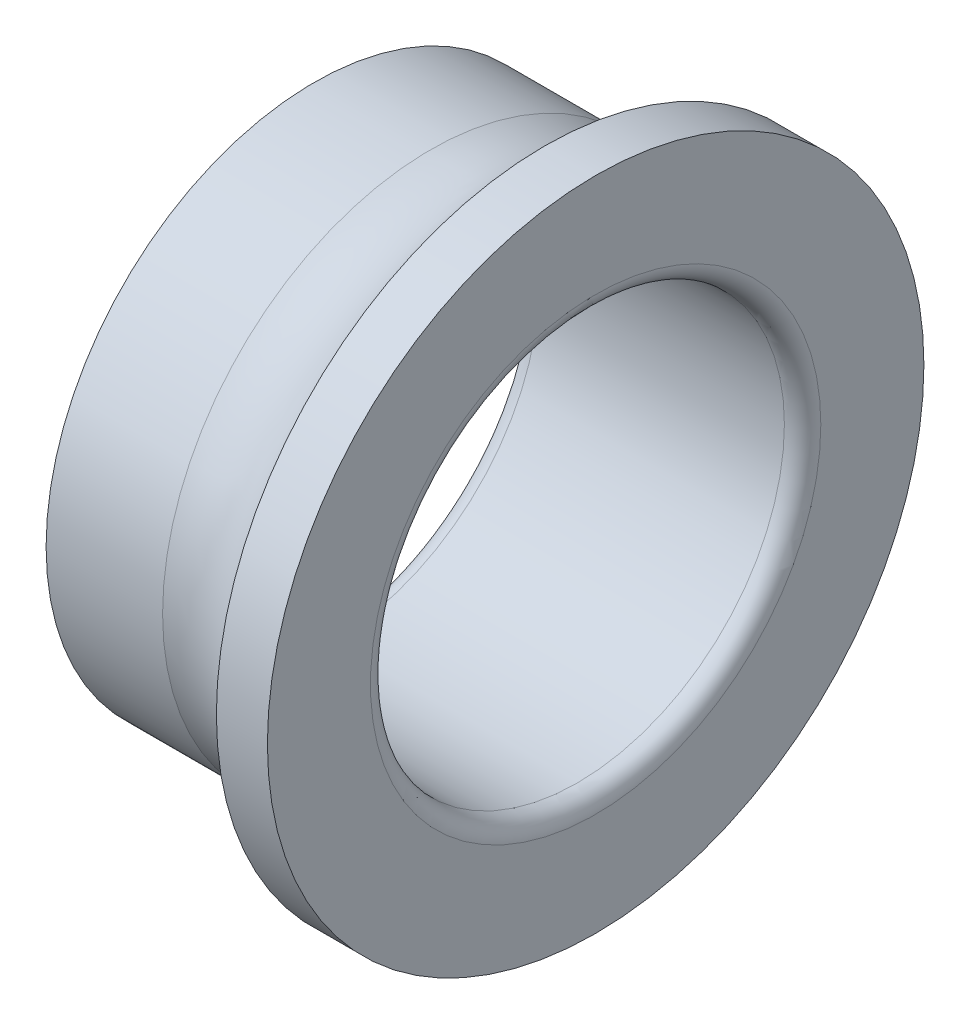
ISO-10303-21;
HEADER;
FILE_DESCRIPTION(('STEP AP214'),'2;1');
FILE_NAME('part.step','',(''),(''),'','','');
FILE_SCHEMA(('AUTOMOTIVE_DESIGN { 1 0 10303 214 1 1 1 1 }'));
ENDSEC;
DATA;
#1=APPLICATION_CONTEXT('core data for automotive mechanical design processes');
#2=APPLICATION_PROTOCOL_DEFINITION('international standard','automotive_design',2000,#1);
#3=PRODUCT_CONTEXT('',#1,'mechanical');
#4=PRODUCT('Part','Part','',(#3));
#5=PRODUCT_RELATED_PRODUCT_CATEGORY('part','',(#4));
#6=PRODUCT_DEFINITION_FORMATION('','',#4);
#7=PRODUCT_DEFINITION_CONTEXT('part definition',#1,'design');
#8=PRODUCT_DEFINITION('design','',#6,#7);
#9=PRODUCT_DEFINITION_SHAPE('','',#8);
#10=(LENGTH_UNIT() NAMED_UNIT(*) SI_UNIT(.MILLI.,.METRE.));
#11=(NAMED_UNIT(*) PLANE_ANGLE_UNIT() SI_UNIT($,.RADIAN.));
#12=(NAMED_UNIT(*) SI_UNIT($,.STERADIAN.) SOLID_ANGLE_UNIT());
#13=UNCERTAINTY_MEASURE_WITH_UNIT(LENGTH_MEASURE(1.E-05),#10,'distance_accuracy_value','');
#14=(GEOMETRIC_REPRESENTATION_CONTEXT(3) GLOBAL_UNCERTAINTY_ASSIGNED_CONTEXT((#13)) GLOBAL_UNIT_ASSIGNED_CONTEXT((#10,
#11,#12)) REPRESENTATION_CONTEXT('',''));
#15=CARTESIAN_POINT('',(0.,0.,0.));
#16=DIRECTION('',(0.,0.,1.));
#17=DIRECTION('',(1.,0.,0.));
#18=AXIS2_PLACEMENT_3D('',#15,#16,#17);
#19=CARTESIAN_POINT('',(8.5,0.,0.));
#20=DIRECTION('',(1.,0.,0.));
#21=DIRECTION('',(0.,0.,-1.));
#22=AXIS2_PLACEMENT_3D('',#19,#20,#21);
#23=TOROIDAL_SURFACE('',#22,21.75,5.75);
#24=CARTESIAN_POINT('',(7.03408731501497,0.,0.));
#25=DIRECTION('',(-1.,0.,0.));
#26=DIRECTION('',(0.,0.,1.));
#27=AXIS2_PLACEMENT_3D('',#24,#25,#26);
#28=CIRCLE('',#27,16.19);
#29=CARTESIAN_POINT('',(7.03408731501497,0.,16.19));
#30=VERTEX_POINT('',#29);
#31=EDGE_CURVE('E115',#30,#30,#28,.T.);
#32=ORIENTED_EDGE('',*,*,#31,.F.);
#33=EDGE_LOOP('',(#32));
#34=FACE_BOUND('',#33,.T.);
#35=CARTESIAN_POINT('',(13.9181985013471,0.,0.));
#36=DIRECTION('',(-1.,0.,0.));
#37=DIRECTION('',(0.,0.,1.));
#38=AXIS2_PLACEMENT_3D('',#35,#36,#37);
#39=CIRCLE('',#38,19.825);
#40=CARTESIAN_POINT('',(13.9181985013471,0.,19.825));
#41=VERTEX_POINT('',#40);
#42=EDGE_CURVE('E120',#41,#41,#39,.F.);
#43=ORIENTED_EDGE('',*,*,#42,.F.);
#44=EDGE_LOOP('',(#43));
#45=FACE_BOUND('',#44,.T.);
#46=ADVANCED_FACE('F20',(#34,#45),#23,.F.);
#47=CARTESIAN_POINT('',(17.,0.,0.));
#48=DIRECTION('',(-1.,0.,0.));
#49=DIRECTION('',(0.,0.,1.));
#50=AXIS2_PLACEMENT_3D('',#47,#48,#49);
#51=CYLINDRICAL_SURFACE('',#50,19.825);
#52=CARTESIAN_POINT('',(17.,0.,0.));
#53=DIRECTION('',(-1.,0.,0.));
#54=DIRECTION('',(0.,0.,1.));
#55=AXIS2_PLACEMENT_3D('',#52,#53,#54);
#56=CIRCLE('',#55,19.825);
#57=CARTESIAN_POINT('',(17.,0.,19.825));
#58=VERTEX_POINT('',#57);
#59=EDGE_CURVE('E24',#58,#58,#56,.F.);
#60=ORIENTED_EDGE('',*,*,#59,.F.);
#61=EDGE_LOOP('',(#60));
#62=FACE_BOUND('',#61,.T.);
#63=ORIENTED_EDGE('',*,*,#42,.T.);
#64=EDGE_LOOP('',(#63));
#65=FACE_BOUND('',#64,.T.);
#66=ADVANCED_FACE('F90',(#62,#65),#51,.T.);
#67=CARTESIAN_POINT('',(17.,0.,0.));
#68=DIRECTION('',(-1.,0.,0.));
#69=DIRECTION('',(0.,0.,1.));
#70=AXIS2_PLACEMENT_3D('',#67,#68,#69);
#71=CYLINDRICAL_SURFACE('',#70,16.19);
#72=ORIENTED_EDGE('',*,*,#31,.T.);
#73=EDGE_LOOP('',(#72));
#74=FACE_BOUND('',#73,.T.);
#75=CARTESIAN_POINT('',(0.,0.,0.));
#76=DIRECTION('',(-1.,0.,0.));
#77=DIRECTION('',(0.,0.,1.));
#78=AXIS2_PLACEMENT_3D('',#75,#76,#77);
#79=CIRCLE('',#78,16.19);
#80=CARTESIAN_POINT('',(0.,0.,16.19));
#81=VERTEX_POINT('',#80);
#82=EDGE_CURVE('E110',#81,#81,#79,.T.);
#83=ORIENTED_EDGE('',*,*,#82,.F.);
#84=EDGE_LOOP('',(#83));
#85=FACE_BOUND('',#84,.T.);
#86=ADVANCED_FACE('F87',(#74,#85),#71,.T.);
#87=CARTESIAN_POINT('',(17.,13.6,0.));
#88=DIRECTION('',(1.,0.,0.));
#89=DIRECTION('',(0.,0.,-1.));
#90=AXIS2_PLACEMENT_3D('',#87,#88,#89);
#91=PLANE('',#90);
#92=CARTESIAN_POINT('',(17.,0.,0.));
#93=DIRECTION('',(1.,0.,0.));
#94=DIRECTION('',(0.,0.,-1.));
#95=AXIS2_PLACEMENT_3D('',#92,#93,#94);
#96=CIRCLE('',#95,13.6);
#97=CARTESIAN_POINT('',(17.,0.,-13.6));
#98=VERTEX_POINT('',#97);
#99=EDGE_CURVE('E71',#98,#98,#96,.T.);
#100=ORIENTED_EDGE('',*,*,#99,.F.);
#101=EDGE_LOOP('',(#100));
#102=FACE_BOUND('',#101,.T.);
#103=ORIENTED_EDGE('',*,*,#59,.T.);
#104=EDGE_LOOP('',(#103));
#105=FACE_BOUND('',#104,.T.);
#106=ADVANCED_FACE('F77',(#102,#105),#91,.T.);
#107=CARTESIAN_POINT('',(0.,16.19,0.));
#108=DIRECTION('',(-1.,0.,0.));
#109=DIRECTION('',(0.,0.,1.));
#110=AXIS2_PLACEMENT_3D('',#107,#108,#109);
#111=PLANE('',#110);
#112=ORIENTED_EDGE('',*,*,#82,.T.);
#113=EDGE_LOOP('',(#112));
#114=FACE_BOUND('',#113,.T.);
#115=CARTESIAN_POINT('',(0.,0.,0.));
#116=DIRECTION('',(-1.,0.,0.));
#117=DIRECTION('',(0.,0.,-1.));
#118=AXIS2_PLACEMENT_3D('',#115,#116,#117);
#119=CIRCLE('',#118,13.6);
#120=CARTESIAN_POINT('',(0.,0.,-13.6));
#121=VERTEX_POINT('',#120);
#122=EDGE_CURVE('E33',#121,#121,#119,.T.);
#123=ORIENTED_EDGE('',*,*,#122,.F.);
#124=EDGE_LOOP('',(#123));
#125=FACE_BOUND('',#124,.T.);
#126=ADVANCED_FACE('F86',(#114,#125),#111,.T.);
#127=CARTESIAN_POINT('',(15.9,0.,0.));
#128=DIRECTION('',(1.,0.,0.));
#129=DIRECTION('',(0.,0.,-1.));
#130=AXIS2_PLACEMENT_3D('',#127,#128,#129);
#131=TOROIDAL_SURFACE('',#130,13.6,1.10000000000001);
#132=CARTESIAN_POINT('',(15.9,0.,0.));
#133=DIRECTION('',(-1.,0.,0.));
#134=DIRECTION('',(0.,0.,1.));
#135=AXIS2_PLACEMENT_3D('',#132,#133,#134);
#136=CIRCLE('',#135,12.5);
#137=CARTESIAN_POINT('',(15.9,0.,12.5));
#138=VERTEX_POINT('',#137);
#139=EDGE_CURVE('E28',#138,#138,#136,.T.);
#140=ORIENTED_EDGE('',*,*,#139,.T.);
#141=EDGE_LOOP('',(#140));
#142=FACE_BOUND('',#141,.T.);
#143=ORIENTED_EDGE('',*,*,#99,.T.);
#144=EDGE_LOOP('',(#143));
#145=FACE_BOUND('',#144,.T.);
#146=ADVANCED_FACE('F51',(#142,#145),#131,.T.);
#147=CARTESIAN_POINT('',(1.1,0.,0.));
#148=DIRECTION('',(1.,0.,0.));
#149=DIRECTION('',(0.,0.,-1.));
#150=AXIS2_PLACEMENT_3D('',#147,#148,#149);
#151=TOROIDAL_SURFACE('',#150,13.6,1.1);
#152=ORIENTED_EDGE('',*,*,#122,.T.);
#153=EDGE_LOOP('',(#152));
#154=FACE_BOUND('',#153,.T.);
#155=CARTESIAN_POINT('',(1.1,0.,0.));
#156=DIRECTION('',(-1.,0.,0.));
#157=DIRECTION('',(0.,0.,1.));
#158=AXIS2_PLACEMENT_3D('',#155,#156,#157);
#159=CIRCLE('',#158,12.5);
#160=CARTESIAN_POINT('',(1.1,0.,12.5));
#161=VERTEX_POINT('',#160);
#162=EDGE_CURVE('E11',#161,#161,#159,.F.);
#163=ORIENTED_EDGE('',*,*,#162,.T.);
#164=EDGE_LOOP('',(#163));
#165=FACE_BOUND('',#164,.T.);
#166=ADVANCED_FACE('F45',(#154,#165),#151,.T.);
#167=CARTESIAN_POINT('',(17.,0.,0.));
#168=DIRECTION('',(-1.,0.,0.));
#169=DIRECTION('',(0.,0.,1.));
#170=AXIS2_PLACEMENT_3D('',#167,#168,#169);
#171=CYLINDRICAL_SURFACE('',#170,12.5);
#172=ORIENTED_EDGE('',*,*,#162,.F.);
#173=EDGE_LOOP('',(#172));
#174=FACE_BOUND('',#173,.T.);
#175=ORIENTED_EDGE('',*,*,#139,.F.);
#176=EDGE_LOOP('',(#175));
#177=FACE_BOUND('',#176,.T.);
#178=ADVANCED_FACE('F50',(#174,#177),#171,.F.);
#179=CLOSED_SHELL('',(#46,#66,#86,#106,#126,#146,#166,#178));
#180=MANIFOLD_SOLID_BREP('B1',#179);
#181=ADVANCED_BREP_SHAPE_REPRESENTATION('',(#18,#180),#14);
#182=SHAPE_DEFINITION_REPRESENTATION(#9,#181);
ENDSEC;
END-ISO-10303-21;
